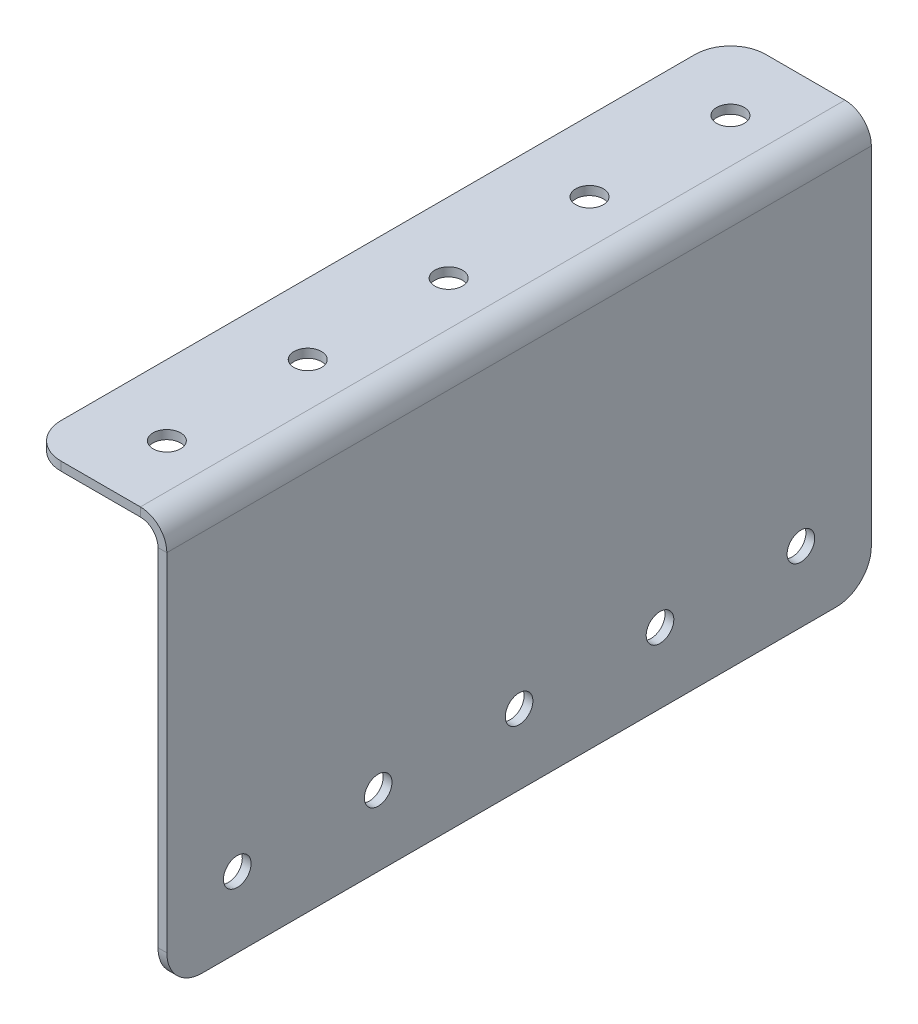
ISO-10303-21;
HEADER;
FILE_DESCRIPTION(('STEP AP214'),'2;1');
FILE_NAME('part.step','',(''),(''),'','','');
FILE_SCHEMA(('AUTOMOTIVE_DESIGN { 1 0 10303 214 1 1 1 1 }'));
ENDSEC;
DATA;
#1=APPLICATION_CONTEXT('core data for automotive mechanical design processes');
#2=APPLICATION_PROTOCOL_DEFINITION('international standard','automotive_design',2000,#1);
#3=PRODUCT_CONTEXT('',#1,'mechanical');
#4=PRODUCT('Part','Part','',(#3));
#5=PRODUCT_RELATED_PRODUCT_CATEGORY('part','',(#4));
#6=PRODUCT_DEFINITION_FORMATION('','',#4);
#7=PRODUCT_DEFINITION_CONTEXT('part definition',#1,'design');
#8=PRODUCT_DEFINITION('design','',#6,#7);
#9=PRODUCT_DEFINITION_SHAPE('','',#8);
#10=(LENGTH_UNIT() NAMED_UNIT(*) SI_UNIT(.MILLI.,.METRE.));
#11=(NAMED_UNIT(*) PLANE_ANGLE_UNIT() SI_UNIT($,.RADIAN.));
#12=(NAMED_UNIT(*) SI_UNIT($,.STERADIAN.) SOLID_ANGLE_UNIT());
#13=UNCERTAINTY_MEASURE_WITH_UNIT(LENGTH_MEASURE(1.E-05),#10,'distance_accuracy_value','');
#14=(GEOMETRIC_REPRESENTATION_CONTEXT(3) GLOBAL_UNCERTAINTY_ASSIGNED_CONTEXT((#13)) GLOBAL_UNIT_ASSIGNED_CONTEXT((#10,
#11,#12)) REPRESENTATION_CONTEXT('',''));
#15=CARTESIAN_POINT('',(0.,0.,0.));
#16=DIRECTION('',(0.,0.,1.));
#17=DIRECTION('',(1.,0.,0.));
#18=AXIS2_PLACEMENT_3D('',#15,#16,#17);
#19=CARTESIAN_POINT('',(39.6875,512.761738,-127.));
#20=DIRECTION('',(0.,1.,0.));
#21=DIRECTION('',(0.,0.,1.));
#22=AXIS2_PLACEMENT_3D('',#19,#20,#21);
#23=PLANE('',#22);
#24=DIRECTION('',(0.,0.,1.));
#25=VECTOR('',#24,1.);
#26=CARTESIAN_POINT('',(38.1,512.761738,-127.));
#27=LINE('',#26,#25);
#28=CARTESIAN_POINT('',(38.1,512.761738,-120.65));
#29=VERTEX_POINT('',#28);
#30=CARTESIAN_POINT('',(38.1,512.761738,-6.34999999999999));
#31=VERTEX_POINT('',#30);
#32=EDGE_CURVE('E218',#29,#31,#27,.T.);
#33=ORIENTED_EDGE('',*,*,#32,.F.);
#34=DIRECTION('',(1.,0.,0.));
#35=VECTOR('',#34,1.);
#36=CARTESIAN_POINT('',(39.6875,512.761738,-120.65));
#37=LINE('',#36,#35);
#38=CARTESIAN_POINT('',(39.6875,512.761738,-120.65));
#39=VERTEX_POINT('',#38);
#40=EDGE_CURVE('E272',#29,#39,#37,.T.);
#41=ORIENTED_EDGE('',*,*,#40,.T.);
#42=DIRECTION('',(0.,0.,1.));
#43=VECTOR('',#42,1.);
#44=CARTESIAN_POINT('',(39.6875,512.761738,-127.));
#45=LINE('',#44,#43);
#46=CARTESIAN_POINT('',(39.6875,512.761738,-6.34999999999999));
#47=VERTEX_POINT('',#46);
#48=EDGE_CURVE('E138',#39,#47,#45,.T.);
#49=ORIENTED_EDGE('',*,*,#48,.T.);
#50=DIRECTION('',(-1.,0.,0.));
#51=VECTOR('',#50,1.);
#52=CARTESIAN_POINT('',(39.6875,512.761738,-6.34999999999999));
#53=LINE('',#52,#51);
#54=EDGE_CURVE('E270',#47,#31,#53,.T.);
#55=ORIENTED_EDGE('',*,*,#54,.T.);
#56=EDGE_LOOP('',(#33,#41,#49,#55));
#57=FACE_BOUND('',#56,.T.);
#58=ADVANCED_FACE('F41',(#57),#23,.F.);
#59=CARTESIAN_POINT('',(39.6875000000001,581.589048146248,-127.));
#60=DIRECTION('',(0.,0.,-1.));
#61=DIRECTION('',(0.,1.,0.));
#62=AXIS2_PLACEMENT_3D('',#59,#60,#61);
#63=PLANE('',#62);
#64=DIRECTION('',(0.,1.,0.));
#65=VECTOR('',#64,1.);
#66=CARTESIAN_POINT('',(39.6875000000001,581.589048146248,-127.));
#67=LINE('',#66,#65);
#68=CARTESIAN_POINT('',(39.6875,519.111738,-127.));
#69=VERTEX_POINT('',#68);
#70=CARTESIAN_POINT('',(39.6875000000001,581.589048146248,-127.));
#71=VERTEX_POINT('',#70);
#72=EDGE_CURVE('E130',#69,#71,#67,.T.);
#73=ORIENTED_EDGE('',*,*,#72,.F.);
#74=DIRECTION('',(-1.,0.,0.));
#75=VECTOR('',#74,1.);
#76=CARTESIAN_POINT('',(39.6875,519.111738,-127.));
#77=LINE('',#76,#75);
#78=CARTESIAN_POINT('',(38.1000000000001,519.111738,-127.));
#79=VERTEX_POINT('',#78);
#80=EDGE_CURVE('E64',#69,#79,#77,.T.);
#81=ORIENTED_EDGE('',*,*,#80,.T.);
#82=DIRECTION('',(0.,1.,0.));
#83=VECTOR('',#82,1.);
#84=CARTESIAN_POINT('',(38.1000000000001,581.589048146248,-127.));
#85=LINE('',#84,#83);
#86=CARTESIAN_POINT('',(38.1000000000001,581.589048146248,-127.));
#87=VERTEX_POINT('',#86);
#88=EDGE_CURVE('E144',#79,#87,#85,.T.);
#89=ORIENTED_EDGE('',*,*,#88,.T.);
#90=DIRECTION('',(1.,0.,0.));
#91=VECTOR('',#90,1.);
#92=CARTESIAN_POINT('',(39.6875000000001,581.589048146248,-127.));
#93=LINE('',#92,#91);
#94=EDGE_CURVE('E141',#87,#71,#93,.T.);
#95=ORIENTED_EDGE('',*,*,#94,.T.);
#96=EDGE_LOOP('',(#73,#81,#89,#95));
#97=FACE_BOUND('',#96,.T.);
#98=ADVANCED_FACE('F143',(#97),#63,.T.);
#99=CARTESIAN_POINT('',(34.925,581.589048146248,-127.));
#100=DIRECTION('',(0.,0.,-1.));
#101=DIRECTION('',(-1.,0.,0.));
#102=AXIS2_PLACEMENT_3D('',#99,#100,#101);
#103=PLANE('',#102);
#104=ORIENTED_EDGE('',*,*,#94,.F.);
#105=CARTESIAN_POINT('',(34.925,581.589048146248,-127.));
#106=DIRECTION('',(0.,0.,1.));
#107=DIRECTION('',(1.,0.,0.));
#108=AXIS2_PLACEMENT_3D('',#105,#106,#107);
#109=CIRCLE('',#108,3.17500000000003);
#110=CARTESIAN_POINT('',(34.925,584.764048146248,-127.));
#111=VERTEX_POINT('',#110);
#112=EDGE_CURVE('E206',#87,#111,#109,.T.);
#113=ORIENTED_EDGE('',*,*,#112,.T.);
#114=DIRECTION('',(0.,1.,0.));
#115=VECTOR('',#114,1.);
#116=CARTESIAN_POINT('',(34.925,586.351548146248,-127.));
#117=LINE('',#116,#115);
#118=CARTESIAN_POINT('',(34.925,586.351548146248,-127.));
#119=VERTEX_POINT('',#118);
#120=EDGE_CURVE('E149',#111,#119,#117,.T.);
#121=ORIENTED_EDGE('',*,*,#120,.T.);
#122=CARTESIAN_POINT('',(34.925,581.589048146248,-127.));
#123=DIRECTION('',(0.,0.,1.));
#124=DIRECTION('',(1.,0.,0.));
#125=AXIS2_PLACEMENT_3D('',#122,#123,#124);
#126=CIRCLE('',#125,4.76250000000003);
#127=EDGE_CURVE('E152',#71,#119,#126,.T.);
#128=ORIENTED_EDGE('',*,*,#127,.F.);
#129=EDGE_LOOP('',(#104,#113,#121,#128));
#130=FACE_BOUND('',#129,.T.);
#131=ADVANCED_FACE('F153',(#130),#103,.T.);
#132=CARTESIAN_POINT('',(14.2875000000001,586.351548146248,-127.));
#133=DIRECTION('',(0.,0.,-1.));
#134=DIRECTION('',(-1.,0.,0.));
#135=AXIS2_PLACEMENT_3D('',#132,#133,#134);
#136=PLANE('',#135);
#137=DIRECTION('',(1.,0.,0.));
#138=VECTOR('',#137,1.);
#139=CARTESIAN_POINT('',(14.2875000000001,584.764048146248,-127.));
#140=LINE('',#139,#138);
#141=CARTESIAN_POINT('',(20.6375000000001,584.764048146248,-127.));
#142=VERTEX_POINT('',#141);
#143=EDGE_CURVE('E201',#111,#142,#140,.F.);
#144=ORIENTED_EDGE('',*,*,#143,.T.);
#145=DIRECTION('',(0.,1.,0.));
#146=VECTOR('',#145,1.);
#147=CARTESIAN_POINT('',(20.6375000000001,586.351548146248,-127.));
#148=LINE('',#147,#146);
#149=CARTESIAN_POINT('',(20.6375000000001,586.351548146248,-127.));
#150=VERTEX_POINT('',#149);
#151=EDGE_CURVE('E148',#142,#150,#148,.T.);
#152=ORIENTED_EDGE('',*,*,#151,.T.);
#153=DIRECTION('',(-1.,0.,0.));
#154=VECTOR('',#153,1.);
#155=CARTESIAN_POINT('',(14.2875000000001,586.351548146248,-127.));
#156=LINE('',#155,#154);
#157=EDGE_CURVE('E187',#119,#150,#156,.T.);
#158=ORIENTED_EDGE('',*,*,#157,.F.);
#159=ORIENTED_EDGE('',*,*,#120,.F.);
#160=EDGE_LOOP('',(#144,#152,#158,#159));
#161=FACE_BOUND('',#160,.T.);
#162=ADVANCED_FACE('F407',(#161),#136,.T.);
#163=CARTESIAN_POINT('',(14.2875000000001,586.351548146248,-127.));
#164=DIRECTION('',(-1.,0.,0.));
#165=DIRECTION('',(0.,0.,1.));
#166=AXIS2_PLACEMENT_3D('',#163,#164,#165);
#167=PLANE('',#166);
#168=DIRECTION('',(0.,0.,1.));
#169=VECTOR('',#168,1.);
#170=CARTESIAN_POINT('',(14.2875000000001,586.351548146248,-127.));
#171=LINE('',#170,#169);
#172=CARTESIAN_POINT('',(14.2875000000001,586.351548146248,-120.65));
#173=VERTEX_POINT('',#172);
#174=CARTESIAN_POINT('',(14.2875000000001,586.351548146248,-6.34999999999999));
#175=VERTEX_POINT('',#174);
#176=EDGE_CURVE('E190',#173,#175,#171,.T.);
#177=ORIENTED_EDGE('',*,*,#176,.F.);
#178=DIRECTION('',(0.,1.,0.));
#179=VECTOR('',#178,1.);
#180=CARTESIAN_POINT('',(14.2875000000001,586.351548146248,-120.65));
#181=LINE('',#180,#179);
#182=CARTESIAN_POINT('',(14.2875000000001,584.764048146248,-120.65));
#183=VERTEX_POINT('',#182);
#184=EDGE_CURVE('E264',#173,#183,#181,.F.);
#185=ORIENTED_EDGE('',*,*,#184,.T.);
#186=DIRECTION('',(0.,0.,1.));
#187=VECTOR('',#186,1.);
#188=CARTESIAN_POINT('',(14.2875000000001,584.764048146248,-127.));
#189=LINE('',#188,#187);
#190=CARTESIAN_POINT('',(14.2875000000001,584.764048146248,-6.34999999999999));
#191=VERTEX_POINT('',#190);
#192=EDGE_CURVE('E207',#183,#191,#189,.T.);
#193=ORIENTED_EDGE('',*,*,#192,.T.);
#194=DIRECTION('',(0.,-1.,0.));
#195=VECTOR('',#194,1.);
#196=CARTESIAN_POINT('',(14.2875000000001,586.351548146248,-6.34999999999999));
#197=LINE('',#196,#195);
#198=EDGE_CURVE('E261',#191,#175,#197,.F.);
#199=ORIENTED_EDGE('',*,*,#198,.T.);
#200=EDGE_LOOP('',(#177,#185,#193,#199));
#201=FACE_BOUND('',#200,.T.);
#202=ADVANCED_FACE('F418',(#201),#167,.T.);
#203=CARTESIAN_POINT('',(14.2875000000001,586.351548146248,0.));
#204=DIRECTION('',(0.,0.,-1.));
#205=DIRECTION('',(-1.,0.,0.));
#206=AXIS2_PLACEMENT_3D('',#203,#204,#205);
#207=PLANE('',#206);
#208=DIRECTION('',(-1.,0.,0.));
#209=VECTOR('',#208,1.);
#210=CARTESIAN_POINT('',(14.2875000000001,586.351548146248,0.));
#211=LINE('',#210,#209);
#212=CARTESIAN_POINT('',(34.925,586.351548146248,0.));
#213=VERTEX_POINT('',#212);
#214=CARTESIAN_POINT('',(20.6375000000001,586.351548146248,0.));
#215=VERTEX_POINT('',#214);
#216=EDGE_CURVE('E182',#213,#215,#211,.T.);
#217=ORIENTED_EDGE('',*,*,#216,.T.);
#218=DIRECTION('',(0.,1.,0.));
#219=VECTOR('',#218,1.);
#220=CARTESIAN_POINT('',(20.6375000000001,586.351548146248,0.));
#221=LINE('',#220,#219);
#222=CARTESIAN_POINT('',(20.6375000000001,584.764048146248,0.));
#223=VERTEX_POINT('',#222);
#224=EDGE_CURVE('E11',#215,#223,#221,.F.);
#225=ORIENTED_EDGE('',*,*,#224,.T.);
#226=DIRECTION('',(1.,0.,0.));
#227=VECTOR('',#226,1.);
#228=CARTESIAN_POINT('',(14.2875000000001,584.764048146248,0.));
#229=LINE('',#228,#227);
#230=CARTESIAN_POINT('',(34.925,584.764048146248,0.));
#231=VERTEX_POINT('',#230);
#232=EDGE_CURVE('E202',#231,#223,#229,.F.);
#233=ORIENTED_EDGE('',*,*,#232,.F.);
#234=DIRECTION('',(0.,1.,0.));
#235=VECTOR('',#234,1.);
#236=CARTESIAN_POINT('',(34.925,586.351548146248,0.));
#237=LINE('',#236,#235);
#238=EDGE_CURVE('E250',#231,#213,#237,.T.);
#239=ORIENTED_EDGE('',*,*,#238,.T.);
#240=EDGE_LOOP('',(#217,#225,#233,#239));
#241=FACE_BOUND('',#240,.T.);
#242=ADVANCED_FACE('F422',(#241),#207,.F.);
#243=CARTESIAN_POINT('',(34.925,581.589048146248,0.));
#244=DIRECTION('',(0.,0.,-1.));
#245=DIRECTION('',(-1.,0.,0.));
#246=AXIS2_PLACEMENT_3D('',#243,#244,#245);
#247=PLANE('',#246);
#248=ORIENTED_EDGE('',*,*,#238,.F.);
#249=CARTESIAN_POINT('',(34.925,581.589048146248,0.));
#250=DIRECTION('',(0.,0.,1.));
#251=DIRECTION('',(1.,0.,0.));
#252=AXIS2_PLACEMENT_3D('',#249,#250,#251);
#253=CIRCLE('',#252,3.17500000000003);
#254=CARTESIAN_POINT('',(38.1000000000001,581.589048146248,0.));
#255=VERTEX_POINT('',#254);
#256=EDGE_CURVE('E203',#255,#231,#253,.T.);
#257=ORIENTED_EDGE('',*,*,#256,.F.);
#258=DIRECTION('',(1.,0.,0.));
#259=VECTOR('',#258,1.);
#260=CARTESIAN_POINT('',(39.6875000000001,581.589048146248,0.));
#261=LINE('',#260,#259);
#262=CARTESIAN_POINT('',(39.6875000000001,581.589048146248,0.));
#263=VERTEX_POINT('',#262);
#264=EDGE_CURVE('E158',#255,#263,#261,.T.);
#265=ORIENTED_EDGE('',*,*,#264,.T.);
#266=CARTESIAN_POINT('',(34.925,581.589048146248,0.));
#267=DIRECTION('',(0.,0.,1.));
#268=DIRECTION('',(1.,0.,0.));
#269=AXIS2_PLACEMENT_3D('',#266,#267,#268);
#270=CIRCLE('',#269,4.76250000000003);
#271=EDGE_CURVE('E159',#263,#213,#270,.T.);
#272=ORIENTED_EDGE('',*,*,#271,.T.);
#273=EDGE_LOOP('',(#248,#257,#265,#272));
#274=FACE_BOUND('',#273,.T.);
#275=ADVANCED_FACE('F385',(#274),#247,.F.);
#276=CARTESIAN_POINT('',(39.6875,525.461738,-12.7));
#277=DIRECTION('',(1.,0.,0.));
#278=DIRECTION('',(0.,1.,0.));
#279=AXIS2_PLACEMENT_3D('',#276,#277,#278);
#280=CYLINDRICAL_SURFACE('',#279,2.48919999999996);
#281=CARTESIAN_POINT('',(39.6875,525.461738,-12.7));
#282=DIRECTION('',(1.,0.,0.));
#283=DIRECTION('',(0.,1.,0.));
#284=AXIS2_PLACEMENT_3D('',#281,#282,#283);
#285=CIRCLE('',#284,2.48919999999996);
#286=CARTESIAN_POINT('',(39.6875,527.950938,-12.7));
#287=VERTEX_POINT('',#286);
#288=EDGE_CURVE('E216',#287,#287,#285,.T.);
#289=ORIENTED_EDGE('',*,*,#288,.T.);
#290=EDGE_LOOP('',(#289));
#291=FACE_BOUND('',#290,.T.);
#292=CARTESIAN_POINT('',(38.1,525.461738,-12.7));
#293=DIRECTION('',(1.,0.,0.));
#294=DIRECTION('',(0.,1.,0.));
#295=AXIS2_PLACEMENT_3D('',#292,#293,#294);
#296=CIRCLE('',#295,2.48919999999996);
#297=CARTESIAN_POINT('',(38.1,527.950938,-12.7));
#298=VERTEX_POINT('',#297);
#299=EDGE_CURVE('E236',#298,#298,#296,.T.);
#300=ORIENTED_EDGE('',*,*,#299,.F.);
#301=EDGE_LOOP('',(#300));
#302=FACE_BOUND('',#301,.T.);
#303=ADVANCED_FACE('F306',(#291,#302),#280,.F.);
#304=CARTESIAN_POINT('',(39.6875,525.461738,-38.1));
#305=DIRECTION('',(1.,0.,0.));
#306=DIRECTION('',(0.,1.,0.));
#307=AXIS2_PLACEMENT_3D('',#304,#305,#306);
#308=CYLINDRICAL_SURFACE('',#307,2.48919999999996);
#309=CARTESIAN_POINT('',(39.6875,525.461738,-38.1));
#310=DIRECTION('',(1.,0.,0.));
#311=DIRECTION('',(0.,1.,0.));
#312=AXIS2_PLACEMENT_3D('',#309,#310,#311);
#313=CIRCLE('',#312,2.48919999999996);
#314=CARTESIAN_POINT('',(39.6875,527.950938,-38.1));
#315=VERTEX_POINT('',#314);
#316=EDGE_CURVE('E300',#315,#315,#313,.T.);
#317=ORIENTED_EDGE('',*,*,#316,.T.);
#318=EDGE_LOOP('',(#317));
#319=FACE_BOUND('',#318,.T.);
#320=CARTESIAN_POINT('',(38.1,525.461738,-38.1));
#321=DIRECTION('',(1.,0.,0.));
#322=DIRECTION('',(0.,1.,0.));
#323=AXIS2_PLACEMENT_3D('',#320,#321,#322);
#324=CIRCLE('',#323,2.48919999999996);
#325=CARTESIAN_POINT('',(38.1,527.950938,-38.1));
#326=VERTEX_POINT('',#325);
#327=EDGE_CURVE('E239',#326,#326,#324,.T.);
#328=ORIENTED_EDGE('',*,*,#327,.F.);
#329=EDGE_LOOP('',(#328));
#330=FACE_BOUND('',#329,.T.);
#331=ADVANCED_FACE('F384',(#319,#330),#308,.F.);
#332=CARTESIAN_POINT('',(39.6875,525.461738,-63.5));
#333=DIRECTION('',(1.,0.,0.));
#334=DIRECTION('',(0.,1.,0.));
#335=AXIS2_PLACEMENT_3D('',#332,#333,#334);
#336=CYLINDRICAL_SURFACE('',#335,2.48919999999996);
#337=CARTESIAN_POINT('',(39.6875,525.461738,-63.5));
#338=DIRECTION('',(1.,0.,0.));
#339=DIRECTION('',(0.,1.,0.));
#340=AXIS2_PLACEMENT_3D('',#337,#338,#339);
#341=CIRCLE('',#340,2.48919999999996);
#342=CARTESIAN_POINT('',(39.6875,527.950938,-63.5));
#343=VERTEX_POINT('',#342);
#344=EDGE_CURVE('E297',#343,#343,#341,.T.);
#345=ORIENTED_EDGE('',*,*,#344,.T.);
#346=EDGE_LOOP('',(#345));
#347=FACE_BOUND('',#346,.T.);
#348=CARTESIAN_POINT('',(38.1,525.461738,-63.5));
#349=DIRECTION('',(1.,0.,0.));
#350=DIRECTION('',(0.,1.,0.));
#351=AXIS2_PLACEMENT_3D('',#348,#349,#350);
#352=CIRCLE('',#351,2.48919999999996);
#353=CARTESIAN_POINT('',(38.1,527.950938,-63.5));
#354=VERTEX_POINT('',#353);
#355=EDGE_CURVE('E242',#354,#354,#352,.T.);
#356=ORIENTED_EDGE('',*,*,#355,.F.);
#357=EDGE_LOOP('',(#356));
#358=FACE_BOUND('',#357,.T.);
#359=ADVANCED_FACE('F388',(#347,#358),#336,.F.);
#360=CARTESIAN_POINT('',(39.6875,525.461738,-88.9));
#361=DIRECTION('',(1.,0.,0.));
#362=DIRECTION('',(0.,1.,0.));
#363=AXIS2_PLACEMENT_3D('',#360,#361,#362);
#364=CYLINDRICAL_SURFACE('',#363,2.48919999999996);
#365=CARTESIAN_POINT('',(39.6875,525.461738,-88.9));
#366=DIRECTION('',(1.,0.,0.));
#367=DIRECTION('',(0.,1.,0.));
#368=AXIS2_PLACEMENT_3D('',#365,#366,#367);
#369=CIRCLE('',#368,2.48919999999996);
#370=CARTESIAN_POINT('',(39.6875,527.950938,-88.9));
#371=VERTEX_POINT('',#370);
#372=EDGE_CURVE('E292',#371,#371,#369,.T.);
#373=ORIENTED_EDGE('',*,*,#372,.T.);
#374=EDGE_LOOP('',(#373));
#375=FACE_BOUND('',#374,.T.);
#376=CARTESIAN_POINT('',(38.1,525.461738,-88.9));
#377=DIRECTION('',(1.,0.,0.));
#378=DIRECTION('',(0.,1.,0.));
#379=AXIS2_PLACEMENT_3D('',#376,#377,#378);
#380=CIRCLE('',#379,2.48919999999996);
#381=CARTESIAN_POINT('',(38.1,527.950938,-88.9));
#382=VERTEX_POINT('',#381);
#383=EDGE_CURVE('E245',#382,#382,#380,.T.);
#384=ORIENTED_EDGE('',*,*,#383,.F.);
#385=EDGE_LOOP('',(#384));
#386=FACE_BOUND('',#385,.T.);
#387=ADVANCED_FACE('F326',(#375,#386),#364,.F.);
#388=CARTESIAN_POINT('',(39.6875,525.461738,-114.3));
#389=DIRECTION('',(1.,0.,0.));
#390=DIRECTION('',(0.,1.,0.));
#391=AXIS2_PLACEMENT_3D('',#388,#389,#390);
#392=CYLINDRICAL_SURFACE('',#391,2.48919999999996);
#393=CARTESIAN_POINT('',(39.6875,525.461738,-114.3));
#394=DIRECTION('',(1.,0.,0.));
#395=DIRECTION('',(0.,1.,0.));
#396=AXIS2_PLACEMENT_3D('',#393,#394,#395);
#397=CIRCLE('',#396,2.48919999999996);
#398=CARTESIAN_POINT('',(39.6875,527.950938,-114.3));
#399=VERTEX_POINT('',#398);
#400=EDGE_CURVE('E289',#399,#399,#397,.T.);
#401=ORIENTED_EDGE('',*,*,#400,.T.);
#402=EDGE_LOOP('',(#401));
#403=FACE_BOUND('',#402,.T.);
#404=CARTESIAN_POINT('',(38.1,525.461738,-114.3));
#405=DIRECTION('',(1.,0.,0.));
#406=DIRECTION('',(0.,1.,0.));
#407=AXIS2_PLACEMENT_3D('',#404,#405,#406);
#408=CIRCLE('',#407,2.48919999999996);
#409=CARTESIAN_POINT('',(38.1,527.950938,-114.3));
#410=VERTEX_POINT('',#409);
#411=EDGE_CURVE('E222',#410,#410,#408,.T.);
#412=ORIENTED_EDGE('',*,*,#411,.F.);
#413=EDGE_LOOP('',(#412));
#414=FACE_BOUND('',#413,.T.);
#415=ADVANCED_FACE('F322',(#403,#414),#392,.F.);
#416=CARTESIAN_POINT('',(26.9875000000001,586.351548146248,-114.3));
#417=DIRECTION('',(0.,1.,0.));
#418=DIRECTION('',(0.,0.,1.));
#419=AXIS2_PLACEMENT_3D('',#416,#417,#418);
#420=CYLINDRICAL_SURFACE('',#419,2.4892);
#421=CARTESIAN_POINT('',(26.9875000000001,586.351548146248,-114.3));
#422=DIRECTION('',(0.,1.,0.));
#423=DIRECTION('',(0.,0.,1.));
#424=AXIS2_PLACEMENT_3D('',#421,#422,#423);
#425=CIRCLE('',#424,2.4892);
#426=CARTESIAN_POINT('',(26.9875000000001,586.351548146248,-111.8108));
#427=VERTEX_POINT('',#426);
#428=EDGE_CURVE('E164',#427,#427,#425,.T.);
#429=ORIENTED_EDGE('',*,*,#428,.T.);
#430=EDGE_LOOP('',(#429));
#431=FACE_BOUND('',#430,.T.);
#432=CARTESIAN_POINT('',(26.9875000000001,584.764048146248,-114.3));
#433=DIRECTION('',(0.,1.,0.));
#434=DIRECTION('',(0.,0.,1.));
#435=AXIS2_PLACEMENT_3D('',#432,#433,#434);
#436=CIRCLE('',#435,2.4892);
#437=CARTESIAN_POINT('',(26.9875000000001,584.764048146248,-111.8108));
#438=VERTEX_POINT('',#437);
#439=EDGE_CURVE('E197',#438,#438,#436,.T.);
#440=ORIENTED_EDGE('',*,*,#439,.F.);
#441=EDGE_LOOP('',(#440));
#442=FACE_BOUND('',#441,.T.);
#443=ADVANCED_FACE('F325',(#431,#442),#420,.F.);
#444=CARTESIAN_POINT('',(26.9875000000001,586.351548146248,-88.9));
#445=DIRECTION('',(0.,1.,0.));
#446=DIRECTION('',(0.,0.,1.));
#447=AXIS2_PLACEMENT_3D('',#444,#445,#446);
#448=CYLINDRICAL_SURFACE('',#447,2.48919999999999);
#449=CARTESIAN_POINT('',(26.9875000000001,586.351548146248,-88.9));
#450=DIRECTION('',(0.,1.,0.));
#451=DIRECTION('',(0.,0.,1.));
#452=AXIS2_PLACEMENT_3D('',#449,#450,#451);
#453=CIRCLE('',#452,2.48919999999999);
#454=CARTESIAN_POINT('',(26.9875000000001,586.351548146248,-86.4108));
#455=VERTEX_POINT('',#454);
#456=EDGE_CURVE('E167',#455,#455,#453,.T.);
#457=ORIENTED_EDGE('',*,*,#456,.T.);
#458=EDGE_LOOP('',(#457));
#459=FACE_BOUND('',#458,.T.);
#460=CARTESIAN_POINT('',(26.9875000000001,584.764048146248,-88.9));
#461=DIRECTION('',(0.,1.,0.));
#462=DIRECTION('',(0.,0.,1.));
#463=AXIS2_PLACEMENT_3D('',#460,#461,#462);
#464=CIRCLE('',#463,2.48919999999999);
#465=CARTESIAN_POINT('',(26.9875000000001,584.764048146248,-86.4108));
#466=VERTEX_POINT('',#465);
#467=EDGE_CURVE('E225',#466,#466,#464,.T.);
#468=ORIENTED_EDGE('',*,*,#467,.F.);
#469=EDGE_LOOP('',(#468));
#470=FACE_BOUND('',#469,.T.);
#471=ADVANCED_FACE('F366',(#459,#470),#448,.F.);
#472=CARTESIAN_POINT('',(26.9875000000001,586.351548146248,-12.7));
#473=DIRECTION('',(0.,1.,0.));
#474=DIRECTION('',(0.,0.,1.));
#475=AXIS2_PLACEMENT_3D('',#472,#473,#474);
#476=CYLINDRICAL_SURFACE('',#475,2.4892);
#477=CARTESIAN_POINT('',(26.9875000000001,586.351548146248,-12.7));
#478=DIRECTION('',(0.,1.,0.));
#479=DIRECTION('',(0.,0.,1.));
#480=AXIS2_PLACEMENT_3D('',#477,#478,#479);
#481=CIRCLE('',#480,2.4892);
#482=CARTESIAN_POINT('',(26.9875000000001,586.351548146248,-10.2108));
#483=VERTEX_POINT('',#482);
#484=EDGE_CURVE('E173',#483,#483,#481,.T.);
#485=ORIENTED_EDGE('',*,*,#484,.T.);
#486=EDGE_LOOP('',(#485));
#487=FACE_BOUND('',#486,.T.);
#488=CARTESIAN_POINT('',(26.9875000000001,584.764048146248,-12.7));
#489=DIRECTION('',(0.,1.,0.));
#490=DIRECTION('',(0.,0.,1.));
#491=AXIS2_PLACEMENT_3D('',#488,#489,#490);
#492=CIRCLE('',#491,2.4892);
#493=CARTESIAN_POINT('',(26.9875000000001,584.764048146248,-10.2108));
#494=VERTEX_POINT('',#493);
#495=EDGE_CURVE('E228',#494,#494,#492,.T.);
#496=ORIENTED_EDGE('',*,*,#495,.F.);
#497=EDGE_LOOP('',(#496));
#498=FACE_BOUND('',#497,.T.);
#499=ADVANCED_FACE('F370',(#487,#498),#476,.F.);
#500=CARTESIAN_POINT('',(26.9875000000001,586.351548146248,-38.1));
#501=DIRECTION('',(0.,1.,0.));
#502=DIRECTION('',(0.,0.,1.));
#503=AXIS2_PLACEMENT_3D('',#500,#501,#502);
#504=CYLINDRICAL_SURFACE('',#503,2.4892);
#505=CARTESIAN_POINT('',(26.9875000000001,586.351548146248,-38.1));
#506=DIRECTION('',(0.,1.,0.));
#507=DIRECTION('',(0.,0.,1.));
#508=AXIS2_PLACEMENT_3D('',#505,#506,#507);
#509=CIRCLE('',#508,2.4892);
#510=CARTESIAN_POINT('',(26.9875000000001,586.351548146248,-35.6108));
#511=VERTEX_POINT('',#510);
#512=EDGE_CURVE('E176',#511,#511,#509,.T.);
#513=ORIENTED_EDGE('',*,*,#512,.T.);
#514=EDGE_LOOP('',(#513));
#515=FACE_BOUND('',#514,.T.);
#516=CARTESIAN_POINT('',(26.9875000000001,584.764048146248,-38.1));
#517=DIRECTION('',(0.,1.,0.));
#518=DIRECTION('',(0.,0.,1.));
#519=AXIS2_PLACEMENT_3D('',#516,#517,#518);
#520=CIRCLE('',#519,2.4892);
#521=CARTESIAN_POINT('',(26.9875000000001,584.764048146248,-35.6108));
#522=VERTEX_POINT('',#521);
#523=EDGE_CURVE('E231',#522,#522,#520,.T.);
#524=ORIENTED_EDGE('',*,*,#523,.F.);
#525=EDGE_LOOP('',(#524));
#526=FACE_BOUND('',#525,.T.);
#527=ADVANCED_FACE('F374',(#515,#526),#504,.F.);
#528=CARTESIAN_POINT('',(26.9875000000001,586.351548146248,-63.5));
#529=DIRECTION('',(0.,1.,0.));
#530=DIRECTION('',(0.,0.,1.));
#531=AXIS2_PLACEMENT_3D('',#528,#529,#530);
#532=CYLINDRICAL_SURFACE('',#531,2.4892);
#533=CARTESIAN_POINT('',(26.9875000000001,586.351548146248,-63.5));
#534=DIRECTION('',(0.,1.,0.));
#535=DIRECTION('',(0.,0.,1.));
#536=AXIS2_PLACEMENT_3D('',#533,#534,#535);
#537=CIRCLE('',#536,2.4892);
#538=CARTESIAN_POINT('',(26.9875000000001,586.351548146248,-61.0108));
#539=VERTEX_POINT('',#538);
#540=EDGE_CURVE('E179',#539,#539,#537,.T.);
#541=ORIENTED_EDGE('',*,*,#540,.T.);
#542=EDGE_LOOP('',(#541));
#543=FACE_BOUND('',#542,.T.);
#544=CARTESIAN_POINT('',(26.9875000000001,584.764048146248,-63.5));
#545=DIRECTION('',(0.,1.,0.));
#546=DIRECTION('',(0.,0.,1.));
#547=AXIS2_PLACEMENT_3D('',#544,#545,#546);
#548=CIRCLE('',#547,2.4892);
#549=CARTESIAN_POINT('',(26.9875000000001,584.764048146248,-61.0108));
#550=VERTEX_POINT('',#549);
#551=EDGE_CURVE('E210',#550,#550,#548,.T.);
#552=ORIENTED_EDGE('',*,*,#551,.F.);
#553=EDGE_LOOP('',(#552));
#554=FACE_BOUND('',#553,.T.);
#555=ADVANCED_FACE('F363',(#543,#554),#532,.F.);
#556=CARTESIAN_POINT('',(39.6875000000001,581.589048146248,0.));
#557=DIRECTION('',(0.,0.,-1.));
#558=DIRECTION('',(0.,1.,0.));
#559=AXIS2_PLACEMENT_3D('',#556,#557,#558);
#560=PLANE('',#559);
#561=DIRECTION('',(0.,1.,0.));
#562=VECTOR('',#561,1.);
#563=CARTESIAN_POINT('',(38.1000000000001,581.589048146248,0.));
#564=LINE('',#563,#562);
#565=CARTESIAN_POINT('',(38.1000000000001,519.111738,0.));
#566=VERTEX_POINT('',#565);
#567=EDGE_CURVE('E220',#566,#255,#564,.T.);
#568=ORIENTED_EDGE('',*,*,#567,.F.);
#569=DIRECTION('',(-1.,0.,0.));
#570=VECTOR('',#569,1.);
#571=CARTESIAN_POINT('',(39.6875,519.111738,0.));
#572=LINE('',#571,#570);
#573=CARTESIAN_POINT('',(39.6875,519.111738,0.));
#574=VERTEX_POINT('',#573);
#575=EDGE_CURVE('E49',#566,#574,#572,.F.);
#576=ORIENTED_EDGE('',*,*,#575,.T.);
#577=DIRECTION('',(0.,1.,0.));
#578=VECTOR('',#577,1.);
#579=CARTESIAN_POINT('',(39.6875000000001,581.589048146248,0.));
#580=LINE('',#579,#578);
#581=EDGE_CURVE('E286',#574,#263,#580,.T.);
#582=ORIENTED_EDGE('',*,*,#581,.T.);
#583=ORIENTED_EDGE('',*,*,#264,.F.);
#584=EDGE_LOOP('',(#568,#576,#582,#583));
#585=FACE_BOUND('',#584,.T.);
#586=ADVANCED_FACE('F284',(#585),#560,.F.);
#587=CARTESIAN_POINT('',(34.925,581.589048146248,-127.));
#588=DIRECTION('',(0.,0.,1.));
#589=DIRECTION('',(1.,0.,0.));
#590=AXIS2_PLACEMENT_3D('',#587,#588,#589);
#591=CYLINDRICAL_SURFACE('',#590,4.76250000000003);
#592=ORIENTED_EDGE('',*,*,#271,.F.);
#593=DIRECTION('',(0.,0.,1.));
#594=VECTOR('',#593,1.);
#595=CARTESIAN_POINT('',(39.6875000000001,581.589048146248,-127.));
#596=LINE('',#595,#594);
#597=EDGE_CURVE('E136',#71,#263,#596,.T.);
#598=ORIENTED_EDGE('',*,*,#597,.F.);
#599=ORIENTED_EDGE('',*,*,#127,.T.);
#600=DIRECTION('',(0.,0.,1.));
#601=VECTOR('',#600,1.);
#602=CARTESIAN_POINT('',(34.925,586.351548146248,-127.));
#603=LINE('',#602,#601);
#604=EDGE_CURVE('E185',#119,#213,#603,.T.);
#605=ORIENTED_EDGE('',*,*,#604,.T.);
#606=EDGE_LOOP('',(#592,#598,#599,#605));
#607=FACE_BOUND('',#606,.T.);
#608=ADVANCED_FACE('F162',(#607),#591,.T.);
#609=CARTESIAN_POINT('',(14.2875000000001,586.351548146248,-127.));
#610=DIRECTION('',(0.,1.,0.));
#611=DIRECTION('',(0.,0.,1.));
#612=AXIS2_PLACEMENT_3D('',#609,#610,#611);
#613=PLANE('',#612);
#614=ORIENTED_EDGE('',*,*,#428,.F.);
#615=EDGE_LOOP('',(#614));
#616=FACE_BOUND('',#615,.T.);
#617=ORIENTED_EDGE('',*,*,#456,.F.);
#618=EDGE_LOOP('',(#617));
#619=FACE_BOUND('',#618,.T.);
#620=ORIENTED_EDGE('',*,*,#484,.F.);
#621=EDGE_LOOP('',(#620));
#622=FACE_BOUND('',#621,.T.);
#623=ORIENTED_EDGE('',*,*,#512,.F.);
#624=EDGE_LOOP('',(#623));
#625=FACE_BOUND('',#624,.T.);
#626=ORIENTED_EDGE('',*,*,#540,.F.);
#627=EDGE_LOOP('',(#626));
#628=FACE_BOUND('',#627,.T.);
#629=ORIENTED_EDGE('',*,*,#157,.T.);
#630=CARTESIAN_POINT('',(20.6375000000001,586.351548146248,-120.65));
#631=DIRECTION('',(0.,1.,0.));
#632=DIRECTION('',(0.,0.,1.));
#633=AXIS2_PLACEMENT_3D('',#630,#631,#632);
#634=CIRCLE('',#633,6.35);
#635=EDGE_CURVE('E259',#150,#173,#634,.T.);
#636=ORIENTED_EDGE('',*,*,#635,.T.);
#637=ORIENTED_EDGE('',*,*,#176,.T.);
#638=CARTESIAN_POINT('',(20.6375000000001,586.351548146248,-6.34999999999999));
#639=DIRECTION('',(0.,1.,0.));
#640=DIRECTION('',(0.,0.,1.));
#641=AXIS2_PLACEMENT_3D('',#638,#639,#640);
#642=CIRCLE('',#641,6.35);
#643=EDGE_CURVE('E257',#175,#215,#642,.T.);
#644=ORIENTED_EDGE('',*,*,#643,.T.);
#645=ORIENTED_EDGE('',*,*,#216,.F.);
#646=ORIENTED_EDGE('',*,*,#604,.F.);
#647=EDGE_LOOP('',(#629,#636,#637,#644,#645,#646));
#648=FACE_BOUND('',#647,.T.);
#649=ADVANCED_FACE('F312',(#616,#619,#622,#625,#628,#648),#613,.T.);
#650=CARTESIAN_POINT('',(39.6875000000001,581.589048146248,-127.));
#651=DIRECTION('',(1.,0.,0.));
#652=DIRECTION('',(0.,1.,0.));
#653=AXIS2_PLACEMENT_3D('',#650,#651,#652);
#654=PLANE('',#653);
#655=ORIENTED_EDGE('',*,*,#288,.F.);
#656=EDGE_LOOP('',(#655));
#657=FACE_BOUND('',#656,.T.);
#658=ORIENTED_EDGE('',*,*,#316,.F.);
#659=EDGE_LOOP('',(#658));
#660=FACE_BOUND('',#659,.T.);
#661=ORIENTED_EDGE('',*,*,#344,.F.);
#662=EDGE_LOOP('',(#661));
#663=FACE_BOUND('',#662,.T.);
#664=ORIENTED_EDGE('',*,*,#372,.F.);
#665=EDGE_LOOP('',(#664));
#666=FACE_BOUND('',#665,.T.);
#667=ORIENTED_EDGE('',*,*,#400,.F.);
#668=EDGE_LOOP('',(#667));
#669=FACE_BOUND('',#668,.T.);
#670=ORIENTED_EDGE('',*,*,#48,.F.);
#671=CARTESIAN_POINT('',(39.6875,519.111738,-120.65));
#672=DIRECTION('',(1.,0.,0.));
#673=DIRECTION('',(0.,1.,0.));
#674=AXIS2_PLACEMENT_3D('',#671,#672,#673);
#675=CIRCLE('',#674,6.35);
#676=EDGE_CURVE('E137',#39,#69,#675,.T.);
#677=ORIENTED_EDGE('',*,*,#676,.T.);
#678=ORIENTED_EDGE('',*,*,#72,.T.);
#679=ORIENTED_EDGE('',*,*,#597,.T.);
#680=ORIENTED_EDGE('',*,*,#581,.F.);
#681=CARTESIAN_POINT('',(39.6875,519.111738,-6.35));
#682=DIRECTION('',(1.,0.,0.));
#683=DIRECTION('',(0.,1.,0.));
#684=AXIS2_PLACEMENT_3D('',#681,#682,#683);
#685=CIRCLE('',#684,6.35);
#686=EDGE_CURVE('E275',#574,#47,#685,.T.);
#687=ORIENTED_EDGE('',*,*,#686,.T.);
#688=EDGE_LOOP('',(#670,#677,#678,#679,#680,#687));
#689=FACE_BOUND('',#688,.T.);
#690=ADVANCED_FACE('F133',(#657,#660,#663,#666,#669,#689),#654,.T.);
#691=CARTESIAN_POINT('',(34.925,581.589048146248,-127.));
#692=DIRECTION('',(0.,0.,1.));
#693=DIRECTION('',(1.,0.,0.));
#694=AXIS2_PLACEMENT_3D('',#691,#692,#693);
#695=CYLINDRICAL_SURFACE('',#694,3.17500000000003);
#696=ORIENTED_EDGE('',*,*,#256,.T.);
#697=DIRECTION('',(0.,0.,1.));
#698=VECTOR('',#697,1.);
#699=CARTESIAN_POINT('',(34.925,584.764048146248,-127.));
#700=LINE('',#699,#698);
#701=EDGE_CURVE('E198',#111,#231,#700,.T.);
#702=ORIENTED_EDGE('',*,*,#701,.F.);
#703=ORIENTED_EDGE('',*,*,#112,.F.);
#704=DIRECTION('',(0.,0.,1.));
#705=VECTOR('',#704,1.);
#706=CARTESIAN_POINT('',(38.1000000000001,581.589048146248,-127.));
#707=LINE('',#706,#705);
#708=EDGE_CURVE('E194',#87,#255,#707,.T.);
#709=ORIENTED_EDGE('',*,*,#708,.T.);
#710=EDGE_LOOP('',(#696,#702,#703,#709));
#711=FACE_BOUND('',#710,.T.);
#712=ADVANCED_FACE('F311',(#711),#695,.F.);
#713=CARTESIAN_POINT('',(14.2875000000001,584.764048146248,-127.));
#714=DIRECTION('',(0.,1.,0.));
#715=DIRECTION('',(0.,0.,1.));
#716=AXIS2_PLACEMENT_3D('',#713,#714,#715);
#717=PLANE('',#716);
#718=ORIENTED_EDGE('',*,*,#439,.T.);
#719=EDGE_LOOP('',(#718));
#720=FACE_BOUND('',#719,.T.);
#721=ORIENTED_EDGE('',*,*,#467,.T.);
#722=EDGE_LOOP('',(#721));
#723=FACE_BOUND('',#722,.T.);
#724=ORIENTED_EDGE('',*,*,#495,.T.);
#725=EDGE_LOOP('',(#724));
#726=FACE_BOUND('',#725,.T.);
#727=ORIENTED_EDGE('',*,*,#523,.T.);
#728=EDGE_LOOP('',(#727));
#729=FACE_BOUND('',#728,.T.);
#730=ORIENTED_EDGE('',*,*,#551,.T.);
#731=EDGE_LOOP('',(#730));
#732=FACE_BOUND('',#731,.T.);
#733=ORIENTED_EDGE('',*,*,#192,.F.);
#734=CARTESIAN_POINT('',(20.6375000000001,584.764048146248,-120.65));
#735=DIRECTION('',(0.,1.,0.));
#736=DIRECTION('',(0.,0.,1.));
#737=AXIS2_PLACEMENT_3D('',#734,#735,#736);
#738=CIRCLE('',#737,6.35);
#739=EDGE_CURVE('E268',#183,#142,#738,.F.);
#740=ORIENTED_EDGE('',*,*,#739,.T.);
#741=ORIENTED_EDGE('',*,*,#143,.F.);
#742=ORIENTED_EDGE('',*,*,#701,.T.);
#743=ORIENTED_EDGE('',*,*,#232,.T.);
#744=CARTESIAN_POINT('',(20.6375000000001,584.764048146248,-6.34999999999999));
#745=DIRECTION('',(0.,1.,0.));
#746=DIRECTION('',(0.,0.,1.));
#747=AXIS2_PLACEMENT_3D('',#744,#745,#746);
#748=CIRCLE('',#747,6.35);
#749=EDGE_CURVE('E266',#223,#191,#748,.F.);
#750=ORIENTED_EDGE('',*,*,#749,.T.);
#751=EDGE_LOOP('',(#733,#740,#741,#742,#743,#750));
#752=FACE_BOUND('',#751,.T.);
#753=ADVANCED_FACE('F333',(#720,#723,#726,#729,#732,#752),#717,.F.);
#754=CARTESIAN_POINT('',(38.1000000000001,581.589048146248,-127.));
#755=DIRECTION('',(1.,0.,0.));
#756=DIRECTION('',(0.,1.,0.));
#757=AXIS2_PLACEMENT_3D('',#754,#755,#756);
#758=PLANE('',#757);
#759=ORIENTED_EDGE('',*,*,#299,.T.);
#760=EDGE_LOOP('',(#759));
#761=FACE_BOUND('',#760,.T.);
#762=ORIENTED_EDGE('',*,*,#327,.T.);
#763=EDGE_LOOP('',(#762));
#764=FACE_BOUND('',#763,.T.);
#765=ORIENTED_EDGE('',*,*,#355,.T.);
#766=EDGE_LOOP('',(#765));
#767=FACE_BOUND('',#766,.T.);
#768=ORIENTED_EDGE('',*,*,#383,.T.);
#769=EDGE_LOOP('',(#768));
#770=FACE_BOUND('',#769,.T.);
#771=ORIENTED_EDGE('',*,*,#411,.T.);
#772=EDGE_LOOP('',(#771));
#773=FACE_BOUND('',#772,.T.);
#774=ORIENTED_EDGE('',*,*,#88,.F.);
#775=CARTESIAN_POINT('',(38.1000000000001,519.111738,-120.65));
#776=DIRECTION('',(1.,0.,0.));
#777=DIRECTION('',(0.,1.,0.));
#778=AXIS2_PLACEMENT_3D('',#775,#776,#777);
#779=CIRCLE('',#778,6.35);
#780=EDGE_CURVE('E280',#79,#29,#779,.F.);
#781=ORIENTED_EDGE('',*,*,#780,.T.);
#782=ORIENTED_EDGE('',*,*,#32,.T.);
#783=CARTESIAN_POINT('',(38.1000000000001,519.111738,-6.35));
#784=DIRECTION('',(1.,0.,0.));
#785=DIRECTION('',(0.,1.,0.));
#786=AXIS2_PLACEMENT_3D('',#783,#784,#785);
#787=CIRCLE('',#786,6.35);
#788=EDGE_CURVE('E56',#31,#566,#787,.F.);
#789=ORIENTED_EDGE('',*,*,#788,.T.);
#790=ORIENTED_EDGE('',*,*,#567,.T.);
#791=ORIENTED_EDGE('',*,*,#708,.F.);
#792=EDGE_LOOP('',(#774,#781,#782,#789,#790,#791));
#793=FACE_BOUND('',#792,.T.);
#794=ADVANCED_FACE('F330',(#761,#764,#767,#770,#773,#793),#758,.F.);
#795=CARTESIAN_POINT('',(20.6375000000001,586.351548146248,-120.65));
#796=DIRECTION('',(0.,1.,0.));
#797=DIRECTION('',(0.,0.,1.));
#798=AXIS2_PLACEMENT_3D('',#795,#796,#797);
#799=CYLINDRICAL_SURFACE('',#798,6.35);
#800=ORIENTED_EDGE('',*,*,#739,.F.);
#801=ORIENTED_EDGE('',*,*,#184,.F.);
#802=ORIENTED_EDGE('',*,*,#635,.F.);
#803=ORIENTED_EDGE('',*,*,#151,.F.);
#804=EDGE_LOOP('',(#800,#801,#802,#803));
#805=FACE_BOUND('',#804,.T.);
#806=ADVANCED_FACE('F332',(#805),#799,.T.);
#807=CARTESIAN_POINT('',(39.6875,519.111738,-120.65));
#808=DIRECTION('',(-1.,0.,0.));
#809=DIRECTION('',(0.,-1.,0.));
#810=AXIS2_PLACEMENT_3D('',#807,#808,#809);
#811=CYLINDRICAL_SURFACE('',#810,6.35);
#812=ORIENTED_EDGE('',*,*,#780,.F.);
#813=ORIENTED_EDGE('',*,*,#80,.F.);
#814=ORIENTED_EDGE('',*,*,#676,.F.);
#815=ORIENTED_EDGE('',*,*,#40,.F.);
#816=EDGE_LOOP('',(#812,#813,#814,#815));
#817=FACE_BOUND('',#816,.T.);
#818=ADVANCED_FACE('F341',(#817),#811,.T.);
#819=CARTESIAN_POINT('',(39.6875,519.111738,-6.35));
#820=DIRECTION('',(1.,0.,0.));
#821=DIRECTION('',(0.,1.,0.));
#822=AXIS2_PLACEMENT_3D('',#819,#820,#821);
#823=CYLINDRICAL_SURFACE('',#822,6.35);
#824=ORIENTED_EDGE('',*,*,#788,.F.);
#825=ORIENTED_EDGE('',*,*,#54,.F.);
#826=ORIENTED_EDGE('',*,*,#686,.F.);
#827=ORIENTED_EDGE('',*,*,#575,.F.);
#828=EDGE_LOOP('',(#824,#825,#826,#827));
#829=FACE_BOUND('',#828,.T.);
#830=ADVANCED_FACE('F344',(#829),#823,.T.);
#831=CARTESIAN_POINT('',(20.6375000000001,586.351548146248,-6.34999999999999));
#832=DIRECTION('',(0.,-1.,0.));
#833=DIRECTION('',(0.,0.,-1.));
#834=AXIS2_PLACEMENT_3D('',#831,#832,#833);
#835=CYLINDRICAL_SURFACE('',#834,6.35);
#836=ORIENTED_EDGE('',*,*,#749,.F.);
#837=ORIENTED_EDGE('',*,*,#224,.F.);
#838=ORIENTED_EDGE('',*,*,#643,.F.);
#839=ORIENTED_EDGE('',*,*,#198,.F.);
#840=EDGE_LOOP('',(#836,#837,#838,#839));
#841=FACE_BOUND('',#840,.T.);
#842=ADVANCED_FACE('F43',(#841),#835,.T.);
#843=CLOSED_SHELL('',(#58,#98,#131,#162,#202,#242,#275,#303,#331,#359,#387,#415,#443,#471,#499,
#527,#555,#586,#608,#649,#690,#712,#753,#794,#806,#818,#830,#842));
#844=MANIFOLD_SOLID_BREP('B2',#843);
#845=ADVANCED_BREP_SHAPE_REPRESENTATION('',(#18,#844),#14);
#846=SHAPE_DEFINITION_REPRESENTATION(#9,#845);
ENDSEC;
END-ISO-10303-21;
